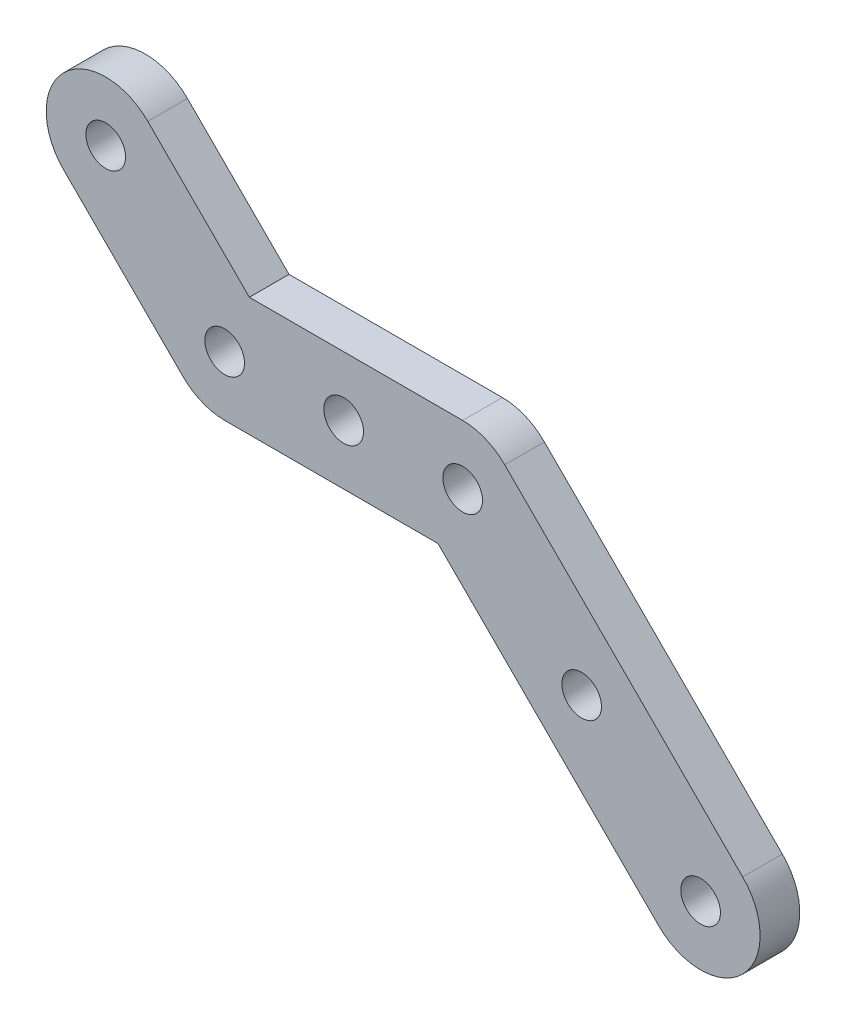
ISO-10303-21;
HEADER;
FILE_DESCRIPTION(('STEP AP214'),'2;1');
FILE_NAME('part.step','',(''),(''),'','','');
FILE_SCHEMA(('AUTOMOTIVE_DESIGN { 1 0 10303 214 1 1 1 1 }'));
ENDSEC;
DATA;
#1=APPLICATION_CONTEXT('core data for automotive mechanical design processes');
#2=APPLICATION_PROTOCOL_DEFINITION('international standard','automotive_design',2000,#1);
#3=PRODUCT_CONTEXT('',#1,'mechanical');
#4=PRODUCT('Part','Part','',(#3));
#5=PRODUCT_RELATED_PRODUCT_CATEGORY('part','',(#4));
#6=PRODUCT_DEFINITION_FORMATION('','',#4);
#7=PRODUCT_DEFINITION_CONTEXT('part definition',#1,'design');
#8=PRODUCT_DEFINITION('design','',#6,#7);
#9=PRODUCT_DEFINITION_SHAPE('','',#8);
#10=(LENGTH_UNIT() NAMED_UNIT(*) SI_UNIT(.MILLI.,.METRE.));
#11=(NAMED_UNIT(*) PLANE_ANGLE_UNIT() SI_UNIT($,.RADIAN.));
#12=(NAMED_UNIT(*) SI_UNIT($,.STERADIAN.) SOLID_ANGLE_UNIT());
#13=UNCERTAINTY_MEASURE_WITH_UNIT(LENGTH_MEASURE(1.E-05),#10,'distance_accuracy_value','');
#14=(GEOMETRIC_REPRESENTATION_CONTEXT(3) GLOBAL_UNCERTAINTY_ASSIGNED_CONTEXT((#13)) GLOBAL_UNIT_ASSIGNED_CONTEXT((#10,
#11,#12)) REPRESENTATION_CONTEXT('',''));
#15=CARTESIAN_POINT('',(0.,0.,0.));
#16=DIRECTION('',(0.,0.,1.));
#17=DIRECTION('',(1.,0.,0.));
#18=AXIS2_PLACEMENT_3D('',#15,#16,#17);
#19=CARTESIAN_POINT('',(278.046711897362,278.046711899028,3.));
#20=DIRECTION('',(0.707106781184429,0.707106781188666,0.));
#21=DIRECTION('',(-0.707106781188666,0.707106781184429,0.));
#22=AXIS2_PLACEMENT_3D('',#19,#20,#21);
#23=PLANE('',#22);
#24=DIRECTION('',(0.707106781188666,-0.707106781184429,0.));
#25=VECTOR('',#24,1.);
#26=CARTESIAN_POINT('',(278.046711897362,278.046711899028,0.));
#27=LINE('',#26,#25);
#28=CARTESIAN_POINT('',(363.1377027977,192.9557209992,0.));
#29=VERTEX_POINT('',#28);
#30=CARTESIAN_POINT('',(379.8196833131,176.2737404839,0.));
#31=VERTEX_POINT('',#30);
#32=EDGE_CURVE('E160',#29,#31,#27,.T.);
#33=ORIENTED_EDGE('',*,*,#32,.T.);
#34=DIRECTION('',(0.,0.,-1.));
#35=VECTOR('',#34,1.);
#36=CARTESIAN_POINT('',(379.8196833131,176.2737404839,3.));
#37=LINE('',#36,#35);
#38=CARTESIAN_POINT('',(379.8196833131,176.2737404839,3.));
#39=VERTEX_POINT('',#38);
#40=EDGE_CURVE('E11',#39,#31,#37,.T.);
#41=ORIENTED_EDGE('',*,*,#40,.F.);
#42=DIRECTION('',(0.707106781188666,-0.707106781184429,0.));
#43=VECTOR('',#42,1.);
#44=CARTESIAN_POINT('',(278.046711897362,278.046711899028,3.));
#45=LINE('',#44,#43);
#46=CARTESIAN_POINT('',(363.1377027977,192.9557209992,3.));
#47=VERTEX_POINT('',#46);
#48=EDGE_CURVE('E224',#47,#39,#45,.T.);
#49=ORIENTED_EDGE('',*,*,#48,.F.);
#50=DIRECTION('',(0.,0.,-1.));
#51=VECTOR('',#50,1.);
#52=CARTESIAN_POINT('',(363.1377027977,192.9557209992,3.));
#53=LINE('',#52,#51);
#54=EDGE_CURVE('E138',#47,#29,#53,.T.);
#55=ORIENTED_EDGE('',*,*,#54,.T.);
#56=EDGE_LOOP('',(#33,#41,#49,#55));
#57=FACE_BOUND('',#56,.T.);
#58=ADVANCED_FACE('F33',(#57),#23,.F.);
#59=CARTESIAN_POINT('',(383.00166382845,179.4557209992,3.));
#60=DIRECTION('',(0.,0.,-1.));
#61=DIRECTION('',(-1.,0.,0.));
#62=AXIS2_PLACEMENT_3D('',#59,#60,#61);
#63=CYLINDRICAL_SURFACE('',#62,4.49999999997955);
#64=CARTESIAN_POINT('',(383.00166382845,179.4557209992,0.));
#65=DIRECTION('',(0.,0.,1.));
#66=DIRECTION('',(1.,0.,0.));
#67=AXIS2_PLACEMENT_3D('',#64,#65,#66);
#68=CIRCLE('',#67,4.49999999997955);
#69=CARTESIAN_POINT('',(386.1836443438,182.6377015145,0.));
#70=VERTEX_POINT('',#69);
#71=EDGE_CURVE('E163',#31,#70,#68,.T.);
#72=ORIENTED_EDGE('',*,*,#71,.T.);
#73=DIRECTION('',(0.,0.,-1.));
#74=VECTOR('',#73,1.);
#75=CARTESIAN_POINT('',(386.1836443438,182.6377015145,3.));
#76=LINE('',#75,#74);
#77=CARTESIAN_POINT('',(386.1836443438,182.6377015145,3.));
#78=VERTEX_POINT('',#77);
#79=EDGE_CURVE('E42',#78,#70,#76,.T.);
#80=ORIENTED_EDGE('',*,*,#79,.F.);
#81=CARTESIAN_POINT('',(383.00166382845,179.4557209992,3.));
#82=DIRECTION('',(0.,0.,1.));
#83=DIRECTION('',(1.,0.,0.));
#84=AXIS2_PLACEMENT_3D('',#81,#82,#83);
#85=CIRCLE('',#84,4.49999999997955);
#86=EDGE_CURVE('E99',#39,#78,#85,.T.);
#87=ORIENTED_EDGE('',*,*,#86,.F.);
#88=ORIENTED_EDGE('',*,*,#40,.T.);
#89=EDGE_LOOP('',(#72,#80,#87,#88));
#90=FACE_BOUND('',#89,.T.);
#91=ADVANCED_FACE('F275',(#90),#63,.T.);
#92=CARTESIAN_POINT('',(284.41067292915,284.41067292915,3.));
#93=DIRECTION('',(-0.707106781186547,-0.707106781186548,0.));
#94=DIRECTION('',(0.707106781186548,-0.707106781186547,0.));
#95=AXIS2_PLACEMENT_3D('',#92,#93,#94);
#96=PLANE('',#95);
#97=DIRECTION('',(-0.707106781186548,0.707106781186547,0.));
#98=VECTOR('',#97,1.);
#99=CARTESIAN_POINT('',(284.41067292915,284.41067292915,0.));
#100=LINE('',#99,#98);
#101=CARTESIAN_POINT('',(368.1836443438,200.6377015145,0.));
#102=VERTEX_POINT('',#101);
#103=EDGE_CURVE('E165',#70,#102,#100,.T.);
#104=ORIENTED_EDGE('',*,*,#103,.T.);
#105=DIRECTION('',(0.,0.,-1.));
#106=VECTOR('',#105,1.);
#107=CARTESIAN_POINT('',(368.1836443438,200.6377015145,3.));
#108=LINE('',#107,#106);
#109=CARTESIAN_POINT('',(368.1836443438,200.6377015145,3.));
#110=VERTEX_POINT('',#109);
#111=EDGE_CURVE('E191',#110,#102,#108,.T.);
#112=ORIENTED_EDGE('',*,*,#111,.F.);
#113=DIRECTION('',(-0.707106781186548,0.707106781186547,0.));
#114=VECTOR('',#113,1.);
#115=CARTESIAN_POINT('',(284.41067292915,284.41067292915,3.));
#116=LINE('',#115,#114);
#117=EDGE_CURVE('E199',#78,#110,#116,.T.);
#118=ORIENTED_EDGE('',*,*,#117,.F.);
#119=ORIENTED_EDGE('',*,*,#79,.T.);
#120=EDGE_LOOP('',(#104,#112,#118,#119));
#121=FACE_BOUND('',#120,.T.);
#122=ADVANCED_FACE('F197',(#121),#96,.F.);
#123=CARTESIAN_POINT('',(365.001663828421,197.4557209992,3.));
#124=DIRECTION('',(0.,0.,-1.));
#125=DIRECTION('',(-1.,0.,0.));
#126=AXIS2_PLACEMENT_3D('',#123,#124,#125);
#127=CYLINDRICAL_SURFACE('',#126,4.49999999999957);
#128=CARTESIAN_POINT('',(365.001663828421,197.4557209992,0.));
#129=DIRECTION('',(0.,0.,1.));
#130=DIRECTION('',(1.,0.,0.));
#131=AXIS2_PLACEMENT_3D('',#128,#129,#130);
#132=CIRCLE('',#131,4.49999999999957);
#133=CARTESIAN_POINT('',(365.0016638284,201.9557209992,0.));
#134=VERTEX_POINT('',#133);
#135=EDGE_CURVE('E167',#102,#134,#132,.T.);
#136=ORIENTED_EDGE('',*,*,#135,.T.);
#137=DIRECTION('',(0.,0.,-1.));
#138=VECTOR('',#137,1.);
#139=CARTESIAN_POINT('',(365.0016638284,201.9557209992,3.));
#140=LINE('',#139,#138);
#141=CARTESIAN_POINT('',(365.0016638284,201.9557209992,3.));
#142=VERTEX_POINT('',#141);
#143=EDGE_CURVE('E188',#142,#134,#140,.T.);
#144=ORIENTED_EDGE('',*,*,#143,.F.);
#145=CARTESIAN_POINT('',(365.001663828421,197.4557209992,3.));
#146=DIRECTION('',(0.,0.,1.));
#147=DIRECTION('',(1.,0.,0.));
#148=AXIS2_PLACEMENT_3D('',#145,#146,#147);
#149=CIRCLE('',#148,4.49999999999957);
#150=EDGE_CURVE('E217',#110,#142,#149,.T.);
#151=ORIENTED_EDGE('',*,*,#150,.F.);
#152=ORIENTED_EDGE('',*,*,#111,.T.);
#153=EDGE_LOOP('',(#136,#144,#151,#152));
#154=FACE_BOUND('',#153,.T.);
#155=ADVANCED_FACE('F208',(#154),#127,.T.);
#156=CARTESIAN_POINT('',(0.,201.9557209992,3.));
#157=DIRECTION('',(0.,-1.,0.));
#158=DIRECTION('',(0.,0.,-1.));
#159=AXIS2_PLACEMENT_3D('',#156,#157,#158);
#160=PLANE('',#159);
#161=DIRECTION('',(-1.,0.,0.));
#162=VECTOR('',#161,1.);
#163=CARTESIAN_POINT('',(0.,201.9557209992,0.));
#164=LINE('',#163,#162);
#165=CARTESIAN_POINT('',(348.8656248591,201.9557209992,0.));
#166=VERTEX_POINT('',#165);
#167=EDGE_CURVE('E169',#134,#166,#164,.T.);
#168=ORIENTED_EDGE('',*,*,#167,.T.);
#169=DIRECTION('',(0.,0.,-1.));
#170=VECTOR('',#169,1.);
#171=CARTESIAN_POINT('',(348.8656248591,201.9557209992,3.));
#172=LINE('',#171,#170);
#173=CARTESIAN_POINT('',(348.8656248591,201.9557209992,3.));
#174=VERTEX_POINT('',#173);
#175=EDGE_CURVE('E185',#174,#166,#172,.T.);
#176=ORIENTED_EDGE('',*,*,#175,.F.);
#177=DIRECTION('',(-1.,0.,0.));
#178=VECTOR('',#177,1.);
#179=CARTESIAN_POINT('',(0.,201.9557209992,3.));
#180=LINE('',#179,#178);
#181=EDGE_CURVE('E214',#142,#174,#180,.T.);
#182=ORIENTED_EDGE('',*,*,#181,.F.);
#183=ORIENTED_EDGE('',*,*,#143,.T.);
#184=EDGE_LOOP('',(#168,#176,#182,#183));
#185=FACE_BOUND('',#184,.T.);
#186=ADVANCED_FACE('F212',(#185),#160,.F.);
#187=CARTESIAN_POINT('',(275.410672929149,275.410672929151,3.));
#188=DIRECTION('',(-0.707106781186545,-0.70710678118655,0.));
#189=DIRECTION('',(0.70710678118655,-0.707106781186545,0.));
#190=AXIS2_PLACEMENT_3D('',#187,#188,#189);
#191=PLANE('',#190);
#192=DIRECTION('',(-0.70710678118655,0.707106781186545,0.));
#193=VECTOR('',#192,1.);
#194=CARTESIAN_POINT('',(275.410672929149,275.410672929151,0.));
#195=LINE('',#194,#193);
#196=CARTESIAN_POINT('',(341.1836443438,209.6377015145,0.));
#197=VERTEX_POINT('',#196);
#198=EDGE_CURVE('E171',#166,#197,#195,.T.);
#199=ORIENTED_EDGE('',*,*,#198,.T.);
#200=DIRECTION('',(0.,0.,-1.));
#201=VECTOR('',#200,1.);
#202=CARTESIAN_POINT('',(341.1836443438,209.6377015145,3.));
#203=LINE('',#202,#201);
#204=CARTESIAN_POINT('',(341.1836443438,209.6377015145,3.));
#205=VERTEX_POINT('',#204);
#206=EDGE_CURVE('E182',#205,#197,#203,.T.);
#207=ORIENTED_EDGE('',*,*,#206,.F.);
#208=DIRECTION('',(-0.70710678118655,0.707106781186545,0.));
#209=VECTOR('',#208,1.);
#210=CARTESIAN_POINT('',(275.410672929149,275.410672929151,3.));
#211=LINE('',#210,#209);
#212=EDGE_CURVE('E216',#174,#205,#211,.T.);
#213=ORIENTED_EDGE('',*,*,#212,.F.);
#214=ORIENTED_EDGE('',*,*,#175,.T.);
#215=EDGE_LOOP('',(#199,#207,#213,#214));
#216=FACE_BOUND('',#215,.T.);
#217=ADVANCED_FACE('F324',(#216),#191,.F.);
#218=CARTESIAN_POINT('',(338.00166382845,206.4557209992,3.));
#219=DIRECTION('',(0.,0.,-1.));
#220=DIRECTION('',(-1.,0.,0.));
#221=AXIS2_PLACEMENT_3D('',#218,#219,#220);
#222=CYLINDRICAL_SURFACE('',#221,4.49999999997955);
#223=CARTESIAN_POINT('',(338.00166382845,206.4557209992,0.));
#224=DIRECTION('',(0.,0.,1.));
#225=DIRECTION('',(1.,0.,0.));
#226=AXIS2_PLACEMENT_3D('',#223,#224,#225);
#227=CIRCLE('',#226,4.49999999997955);
#228=CARTESIAN_POINT('',(334.8196833131,203.2737404839,0.));
#229=VERTEX_POINT('',#228);
#230=EDGE_CURVE('E173',#197,#229,#227,.T.);
#231=ORIENTED_EDGE('',*,*,#230,.T.);
#232=DIRECTION('',(0.,0.,-1.));
#233=VECTOR('',#232,1.);
#234=CARTESIAN_POINT('',(334.8196833131,203.2737404839,3.));
#235=LINE('',#234,#233);
#236=CARTESIAN_POINT('',(334.8196833131,203.2737404839,3.));
#237=VERTEX_POINT('',#236);
#238=EDGE_CURVE('E133',#237,#229,#235,.T.);
#239=ORIENTED_EDGE('',*,*,#238,.F.);
#240=CARTESIAN_POINT('',(338.00166382845,206.4557209992,3.));
#241=DIRECTION('',(0.,0.,1.));
#242=DIRECTION('',(1.,0.,0.));
#243=AXIS2_PLACEMENT_3D('',#240,#241,#242);
#244=CIRCLE('',#243,4.49999999997955);
#245=EDGE_CURVE('E124',#205,#237,#244,.T.);
#246=ORIENTED_EDGE('',*,*,#245,.F.);
#247=ORIENTED_EDGE('',*,*,#206,.T.);
#248=EDGE_LOOP('',(#231,#239,#246,#247));
#249=FACE_BOUND('',#248,.T.);
#250=ADVANCED_FACE('F321',(#249),#222,.T.);
#251=CARTESIAN_POINT('',(269.0467118985,269.0467118985,3.));
#252=DIRECTION('',(0.707106781186547,0.707106781186547,0.));
#253=DIRECTION('',(-0.707106781186548,0.707106781186548,0.));
#254=AXIS2_PLACEMENT_3D('',#251,#252,#253);
#255=PLANE('',#254);
#256=DIRECTION('',(0.707106781186548,-0.707106781186548,0.));
#257=VECTOR('',#256,1.);
#258=CARTESIAN_POINT('',(269.0467118985,269.0467118985,0.));
#259=LINE('',#258,#257);
#260=CARTESIAN_POINT('',(343.8196833131,194.2737404839,0.));
#261=VERTEX_POINT('',#260);
#262=EDGE_CURVE('E132',#229,#261,#259,.T.);
#263=ORIENTED_EDGE('',*,*,#262,.T.);
#264=DIRECTION('',(0.,0.,-1.));
#265=VECTOR('',#264,1.);
#266=CARTESIAN_POINT('',(343.8196833131,194.2737404839,3.));
#267=LINE('',#266,#265);
#268=CARTESIAN_POINT('',(343.8196833131,194.2737404839,3.));
#269=VERTEX_POINT('',#268);
#270=EDGE_CURVE('E129',#269,#261,#267,.T.);
#271=ORIENTED_EDGE('',*,*,#270,.F.);
#272=DIRECTION('',(0.707106781186548,-0.707106781186548,0.));
#273=VECTOR('',#272,1.);
#274=CARTESIAN_POINT('',(269.0467118985,269.0467118985,3.));
#275=LINE('',#274,#273);
#276=EDGE_CURVE('E118',#237,#269,#275,.T.);
#277=ORIENTED_EDGE('',*,*,#276,.F.);
#278=ORIENTED_EDGE('',*,*,#238,.T.);
#279=EDGE_LOOP('',(#263,#271,#277,#278));
#280=FACE_BOUND('',#279,.T.);
#281=ADVANCED_FACE('F130',(#280),#255,.F.);
#282=CARTESIAN_POINT('',(347.001663828479,197.4557209992,3.));
#283=DIRECTION('',(0.,0.,-1.));
#284=DIRECTION('',(-1.,0.,0.));
#285=AXIS2_PLACEMENT_3D('',#282,#283,#284);
#286=CYLINDRICAL_SURFACE('',#285,4.50000000000003);
#287=CARTESIAN_POINT('',(347.001663828479,197.4557209992,0.));
#288=DIRECTION('',(0.,0.,1.));
#289=DIRECTION('',(1.,0.,0.));
#290=AXIS2_PLACEMENT_3D('',#287,#288,#289);
#291=CIRCLE('',#290,4.50000000000003);
#292=CARTESIAN_POINT('',(347.0016638284,192.9557209992,0.));
#293=VERTEX_POINT('',#292);
#294=EDGE_CURVE('E85',#261,#293,#291,.T.);
#295=ORIENTED_EDGE('',*,*,#294,.T.);
#296=DIRECTION('',(0.,0.,-1.));
#297=VECTOR('',#296,1.);
#298=CARTESIAN_POINT('',(347.0016638284,192.9557209992,3.));
#299=LINE('',#298,#297);
#300=CARTESIAN_POINT('',(347.0016638284,192.9557209992,3.));
#301=VERTEX_POINT('',#300);
#302=EDGE_CURVE('E134',#301,#293,#299,.T.);
#303=ORIENTED_EDGE('',*,*,#302,.F.);
#304=CARTESIAN_POINT('',(347.001663828479,197.4557209992,3.));
#305=DIRECTION('',(0.,0.,1.));
#306=DIRECTION('',(1.,0.,0.));
#307=AXIS2_PLACEMENT_3D('',#304,#305,#306);
#308=CIRCLE('',#307,4.50000000000003);
#309=EDGE_CURVE('E122',#269,#301,#308,.T.);
#310=ORIENTED_EDGE('',*,*,#309,.F.);
#311=ORIENTED_EDGE('',*,*,#270,.T.);
#312=EDGE_LOOP('',(#295,#303,#310,#311));
#313=FACE_BOUND('',#312,.T.);
#314=ADVANCED_FACE('F136',(#313),#286,.T.);
#315=CARTESIAN_POINT('',(338.00166382845,206.4557209992,3.));
#316=DIRECTION('',(0.,0.,-1.));
#317=DIRECTION('',(-1.,0.,0.));
#318=AXIS2_PLACEMENT_3D('',#315,#316,#317);
#319=CYLINDRICAL_SURFACE('',#318,1.49999999995004);
#320=CARTESIAN_POINT('',(338.00166382845,206.4557209992,3.));
#321=DIRECTION('',(0.,0.,1.));
#322=DIRECTION('',(1.,0.,0.));
#323=AXIS2_PLACEMENT_3D('',#320,#321,#322);
#324=CIRCLE('',#323,1.49999999995004);
#325=CARTESIAN_POINT('',(339.5016638284,206.4557209992,3.));
#326=VERTEX_POINT('',#325);
#327=EDGE_CURVE('E226',#326,#326,#324,.T.);
#328=ORIENTED_EDGE('',*,*,#327,.T.);
#329=EDGE_LOOP('',(#328));
#330=FACE_BOUND('',#329,.T.);
#331=CARTESIAN_POINT('',(338.00166382845,206.4557209992,0.));
#332=DIRECTION('',(0.,0.,1.));
#333=DIRECTION('',(1.,0.,0.));
#334=AXIS2_PLACEMENT_3D('',#331,#332,#333);
#335=CIRCLE('',#334,1.49999999995004);
#336=CARTESIAN_POINT('',(339.5016638284,206.4557209992,0.));
#337=VERTEX_POINT('',#336);
#338=EDGE_CURVE('E157',#337,#337,#335,.T.);
#339=ORIENTED_EDGE('',*,*,#338,.F.);
#340=EDGE_LOOP('',(#339));
#341=FACE_BOUND('',#340,.T.);
#342=ADVANCED_FACE('F260',(#330,#341),#319,.F.);
#343=CARTESIAN_POINT('',(347.001663828479,197.4557209992,3.));
#344=DIRECTION('',(0.,0.,-1.));
#345=DIRECTION('',(-1.,0.,0.));
#346=AXIS2_PLACEMENT_3D('',#343,#344,#345);
#347=CYLINDRICAL_SURFACE('',#346,1.49999999992112);
#348=CARTESIAN_POINT('',(347.001663828479,197.4557209992,3.));
#349=DIRECTION('',(0.,0.,1.));
#350=DIRECTION('',(1.,0.,0.));
#351=AXIS2_PLACEMENT_3D('',#348,#349,#350);
#352=CIRCLE('',#351,1.49999999992112);
#353=CARTESIAN_POINT('',(348.5016638284,197.4557209992,3.));
#354=VERTEX_POINT('',#353);
#355=EDGE_CURVE('E229',#354,#354,#352,.T.);
#356=ORIENTED_EDGE('',*,*,#355,.T.);
#357=EDGE_LOOP('',(#356));
#358=FACE_BOUND('',#357,.T.);
#359=CARTESIAN_POINT('',(347.001663828479,197.4557209992,0.));
#360=DIRECTION('',(0.,0.,1.));
#361=DIRECTION('',(1.,0.,0.));
#362=AXIS2_PLACEMENT_3D('',#359,#360,#361);
#363=CIRCLE('',#362,1.49999999992112);
#364=CARTESIAN_POINT('',(348.5016638284,197.4557209992,0.));
#365=VERTEX_POINT('',#364);
#366=EDGE_CURVE('E154',#365,#365,#363,.T.);
#367=ORIENTED_EDGE('',*,*,#366,.F.);
#368=EDGE_LOOP('',(#367));
#369=FACE_BOUND('',#368,.T.);
#370=ADVANCED_FACE('F263',(#358,#369),#347,.F.);
#371=CARTESIAN_POINT('',(374.0016638284,188.4557209992,3.));
#372=DIRECTION('',(0.,0.,-1.));
#373=DIRECTION('',(-1.,0.,0.));
#374=AXIS2_PLACEMENT_3D('',#371,#372,#373);
#375=CYLINDRICAL_SURFACE('',#374,1.5);
#376=CARTESIAN_POINT('',(374.0016638284,188.4557209992,3.));
#377=DIRECTION('',(0.,0.,1.));
#378=DIRECTION('',(1.,0.,0.));
#379=AXIS2_PLACEMENT_3D('',#376,#377,#378);
#380=CIRCLE('',#379,1.5);
#381=CARTESIAN_POINT('',(375.5016638284,188.4557209992,3.));
#382=VERTEX_POINT('',#381);
#383=EDGE_CURVE('E232',#382,#382,#380,.T.);
#384=ORIENTED_EDGE('',*,*,#383,.T.);
#385=EDGE_LOOP('',(#384));
#386=FACE_BOUND('',#385,.T.);
#387=CARTESIAN_POINT('',(374.0016638284,188.4557209992,0.));
#388=DIRECTION('',(0.,0.,1.));
#389=DIRECTION('',(1.,0.,0.));
#390=AXIS2_PLACEMENT_3D('',#387,#388,#389);
#391=CIRCLE('',#390,1.5);
#392=CARTESIAN_POINT('',(375.5016638284,188.4557209992,0.));
#393=VERTEX_POINT('',#392);
#394=EDGE_CURVE('E151',#393,#393,#391,.T.);
#395=ORIENTED_EDGE('',*,*,#394,.F.);
#396=EDGE_LOOP('',(#395));
#397=FACE_BOUND('',#396,.T.);
#398=ADVANCED_FACE('F286',(#386,#397),#375,.F.);
#399=CARTESIAN_POINT('',(383.00166382845,179.4557209992,3.));
#400=DIRECTION('',(0.,0.,-1.));
#401=DIRECTION('',(-1.,0.,0.));
#402=AXIS2_PLACEMENT_3D('',#399,#400,#401);
#403=CYLINDRICAL_SURFACE('',#402,1.49999999995004);
#404=CARTESIAN_POINT('',(383.00166382845,179.4557209992,3.));
#405=DIRECTION('',(0.,0.,1.));
#406=DIRECTION('',(1.,0.,0.));
#407=AXIS2_PLACEMENT_3D('',#404,#405,#406);
#408=CIRCLE('',#407,1.49999999995004);
#409=CARTESIAN_POINT('',(384.5016638284,179.4557209992,3.));
#410=VERTEX_POINT('',#409);
#411=EDGE_CURVE('E235',#410,#410,#408,.T.);
#412=ORIENTED_EDGE('',*,*,#411,.T.);
#413=EDGE_LOOP('',(#412));
#414=FACE_BOUND('',#413,.T.);
#415=CARTESIAN_POINT('',(383.00166382845,179.4557209992,0.));
#416=DIRECTION('',(0.,0.,1.));
#417=DIRECTION('',(1.,0.,0.));
#418=AXIS2_PLACEMENT_3D('',#415,#416,#417);
#419=CIRCLE('',#418,1.49999999995004);
#420=CARTESIAN_POINT('',(384.5016638284,179.4557209992,0.));
#421=VERTEX_POINT('',#420);
#422=EDGE_CURVE('E148',#421,#421,#419,.T.);
#423=ORIENTED_EDGE('',*,*,#422,.F.);
#424=EDGE_LOOP('',(#423));
#425=FACE_BOUND('',#424,.T.);
#426=ADVANCED_FACE('F290',(#414,#425),#403,.F.);
#427=CARTESIAN_POINT('',(365.001663828421,197.4557209992,3.));
#428=DIRECTION('',(0.,0.,-1.));
#429=DIRECTION('',(-1.,0.,0.));
#430=AXIS2_PLACEMENT_3D('',#427,#428,#429);
#431=CYLINDRICAL_SURFACE('',#430,1.49999999997885);
#432=CARTESIAN_POINT('',(365.001663828421,197.4557209992,3.));
#433=DIRECTION('',(0.,0.,1.));
#434=DIRECTION('',(1.,0.,0.));
#435=AXIS2_PLACEMENT_3D('',#432,#433,#434);
#436=CIRCLE('',#435,1.49999999997885);
#437=CARTESIAN_POINT('',(366.5016638284,197.4557209992,3.));
#438=VERTEX_POINT('',#437);
#439=EDGE_CURVE('E238',#438,#438,#436,.T.);
#440=ORIENTED_EDGE('',*,*,#439,.T.);
#441=EDGE_LOOP('',(#440));
#442=FACE_BOUND('',#441,.T.);
#443=CARTESIAN_POINT('',(365.001663828421,197.4557209992,0.));
#444=DIRECTION('',(0.,0.,1.));
#445=DIRECTION('',(1.,0.,0.));
#446=AXIS2_PLACEMENT_3D('',#443,#444,#445);
#447=CIRCLE('',#446,1.49999999997885);
#448=CARTESIAN_POINT('',(366.5016638284,197.4557209992,0.));
#449=VERTEX_POINT('',#448);
#450=EDGE_CURVE('E145',#449,#449,#447,.T.);
#451=ORIENTED_EDGE('',*,*,#450,.F.);
#452=EDGE_LOOP('',(#451));
#453=FACE_BOUND('',#452,.T.);
#454=ADVANCED_FACE('F293',(#442,#453),#431,.F.);
#455=CARTESIAN_POINT('',(356.0016638284,197.4557209992,3.));
#456=DIRECTION('',(0.,0.,-1.));
#457=DIRECTION('',(-1.,0.,0.));
#458=AXIS2_PLACEMENT_3D('',#455,#456,#457);
#459=CYLINDRICAL_SURFACE('',#458,1.5);
#460=CARTESIAN_POINT('',(356.0016638284,197.4557209992,3.));
#461=DIRECTION('',(0.,0.,1.));
#462=DIRECTION('',(1.,0.,0.));
#463=AXIS2_PLACEMENT_3D('',#460,#461,#462);
#464=CIRCLE('',#463,1.5);
#465=CARTESIAN_POINT('',(357.5016638284,197.4557209992,3.));
#466=VERTEX_POINT('',#465);
#467=EDGE_CURVE('E178',#466,#466,#464,.T.);
#468=ORIENTED_EDGE('',*,*,#467,.T.);
#469=EDGE_LOOP('',(#468));
#470=FACE_BOUND('',#469,.T.);
#471=CARTESIAN_POINT('',(356.0016638284,197.4557209992,0.));
#472=DIRECTION('',(0.,0.,1.));
#473=DIRECTION('',(1.,0.,0.));
#474=AXIS2_PLACEMENT_3D('',#471,#472,#473);
#475=CIRCLE('',#474,1.5);
#476=CARTESIAN_POINT('',(357.5016638284,197.4557209992,0.));
#477=VERTEX_POINT('',#476);
#478=EDGE_CURVE('E142',#477,#477,#475,.T.);
#479=ORIENTED_EDGE('',*,*,#478,.F.);
#480=EDGE_LOOP('',(#479));
#481=FACE_BOUND('',#480,.T.);
#482=ADVANCED_FACE('F35',(#470,#481),#459,.F.);
#483=CARTESIAN_POINT('',(0.,192.9557209992,3.));
#484=DIRECTION('',(0.,1.,0.));
#485=DIRECTION('',(0.,0.,1.));
#486=AXIS2_PLACEMENT_3D('',#483,#484,#485);
#487=PLANE('',#486);
#488=DIRECTION('',(1.,0.,0.));
#489=VECTOR('',#488,1.);
#490=CARTESIAN_POINT('',(0.,192.9557209992,0.));
#491=LINE('',#490,#489);
#492=EDGE_CURVE('E91',#293,#29,#491,.T.);
#493=ORIENTED_EDGE('',*,*,#492,.T.);
#494=ORIENTED_EDGE('',*,*,#54,.F.);
#495=DIRECTION('',(1.,0.,0.));
#496=VECTOR('',#495,1.);
#497=CARTESIAN_POINT('',(0.,192.9557209992,3.));
#498=LINE('',#497,#496);
#499=EDGE_CURVE('E50',#301,#47,#498,.T.);
#500=ORIENTED_EDGE('',*,*,#499,.F.);
#501=ORIENTED_EDGE('',*,*,#302,.T.);
#502=EDGE_LOOP('',(#493,#494,#500,#501));
#503=FACE_BOUND('',#502,.T.);
#504=ADVANCED_FACE('F248',(#503),#487,.F.);
#505=CARTESIAN_POINT('',(0.,0.,3.));
#506=DIRECTION('',(0.,0.,1.));
#507=DIRECTION('',(1.,0.,0.));
#508=AXIS2_PLACEMENT_3D('',#505,#506,#507);
#509=PLANE('',#508);
#510=ORIENTED_EDGE('',*,*,#467,.F.);
#511=EDGE_LOOP('',(#510));
#512=FACE_BOUND('',#511,.T.);
#513=ORIENTED_EDGE('',*,*,#439,.F.);
#514=EDGE_LOOP('',(#513));
#515=FACE_BOUND('',#514,.T.);
#516=ORIENTED_EDGE('',*,*,#411,.F.);
#517=EDGE_LOOP('',(#516));
#518=FACE_BOUND('',#517,.T.);
#519=ORIENTED_EDGE('',*,*,#383,.F.);
#520=EDGE_LOOP('',(#519));
#521=FACE_BOUND('',#520,.T.);
#522=ORIENTED_EDGE('',*,*,#355,.F.);
#523=EDGE_LOOP('',(#522));
#524=FACE_BOUND('',#523,.T.);
#525=ORIENTED_EDGE('',*,*,#327,.F.);
#526=EDGE_LOOP('',(#525));
#527=FACE_BOUND('',#526,.T.);
#528=ORIENTED_EDGE('',*,*,#48,.T.);
#529=ORIENTED_EDGE('',*,*,#86,.T.);
#530=ORIENTED_EDGE('',*,*,#117,.T.);
#531=ORIENTED_EDGE('',*,*,#150,.T.);
#532=ORIENTED_EDGE('',*,*,#181,.T.);
#533=ORIENTED_EDGE('',*,*,#212,.T.);
#534=ORIENTED_EDGE('',*,*,#245,.T.);
#535=ORIENTED_EDGE('',*,*,#276,.T.);
#536=ORIENTED_EDGE('',*,*,#309,.T.);
#537=ORIENTED_EDGE('',*,*,#499,.T.);
#538=EDGE_LOOP('',(#528,#529,#530,#531,#532,#533,#534,#535,#536,#537));
#539=FACE_BOUND('',#538,.T.);
#540=ADVANCED_FACE('F120',(#512,#515,#518,#521,#524,#527,#539),#509,.T.);
#541=CARTESIAN_POINT('',(0.,0.,0.));
#542=DIRECTION('',(0.,0.,1.));
#543=DIRECTION('',(1.,0.,0.));
#544=AXIS2_PLACEMENT_3D('',#541,#542,#543);
#545=PLANE('',#544);
#546=ORIENTED_EDGE('',*,*,#478,.T.);
#547=EDGE_LOOP('',(#546));
#548=FACE_BOUND('',#547,.T.);
#549=ORIENTED_EDGE('',*,*,#450,.T.);
#550=EDGE_LOOP('',(#549));
#551=FACE_BOUND('',#550,.T.);
#552=ORIENTED_EDGE('',*,*,#422,.T.);
#553=EDGE_LOOP('',(#552));
#554=FACE_BOUND('',#553,.T.);
#555=ORIENTED_EDGE('',*,*,#394,.T.);
#556=EDGE_LOOP('',(#555));
#557=FACE_BOUND('',#556,.T.);
#558=ORIENTED_EDGE('',*,*,#366,.T.);
#559=EDGE_LOOP('',(#558));
#560=FACE_BOUND('',#559,.T.);
#561=ORIENTED_EDGE('',*,*,#338,.T.);
#562=EDGE_LOOP('',(#561));
#563=FACE_BOUND('',#562,.T.);
#564=ORIENTED_EDGE('',*,*,#32,.F.);
#565=ORIENTED_EDGE('',*,*,#492,.F.);
#566=ORIENTED_EDGE('',*,*,#294,.F.);
#567=ORIENTED_EDGE('',*,*,#262,.F.);
#568=ORIENTED_EDGE('',*,*,#230,.F.);
#569=ORIENTED_EDGE('',*,*,#198,.F.);
#570=ORIENTED_EDGE('',*,*,#167,.F.);
#571=ORIENTED_EDGE('',*,*,#135,.F.);
#572=ORIENTED_EDGE('',*,*,#103,.F.);
#573=ORIENTED_EDGE('',*,*,#71,.F.);
#574=EDGE_LOOP('',(#564,#565,#566,#567,#568,#569,#570,#571,#572,#573));
#575=FACE_BOUND('',#574,.T.);
#576=ADVANCED_FACE('F203',(#548,#551,#554,#557,#560,#563,#575),#545,.F.);
#577=CLOSED_SHELL('',(#58,#91,#122,#155,#186,#217,#250,#281,#314,#342,#370,#398,#426,#454,#482,
#504,#540,#576));
#578=MANIFOLD_SOLID_BREP('B2',#577);
#579=ADVANCED_BREP_SHAPE_REPRESENTATION('',(#18,#578),#14);
#580=SHAPE_DEFINITION_REPRESENTATION(#9,#579);
ENDSEC;
END-ISO-10303-21;
